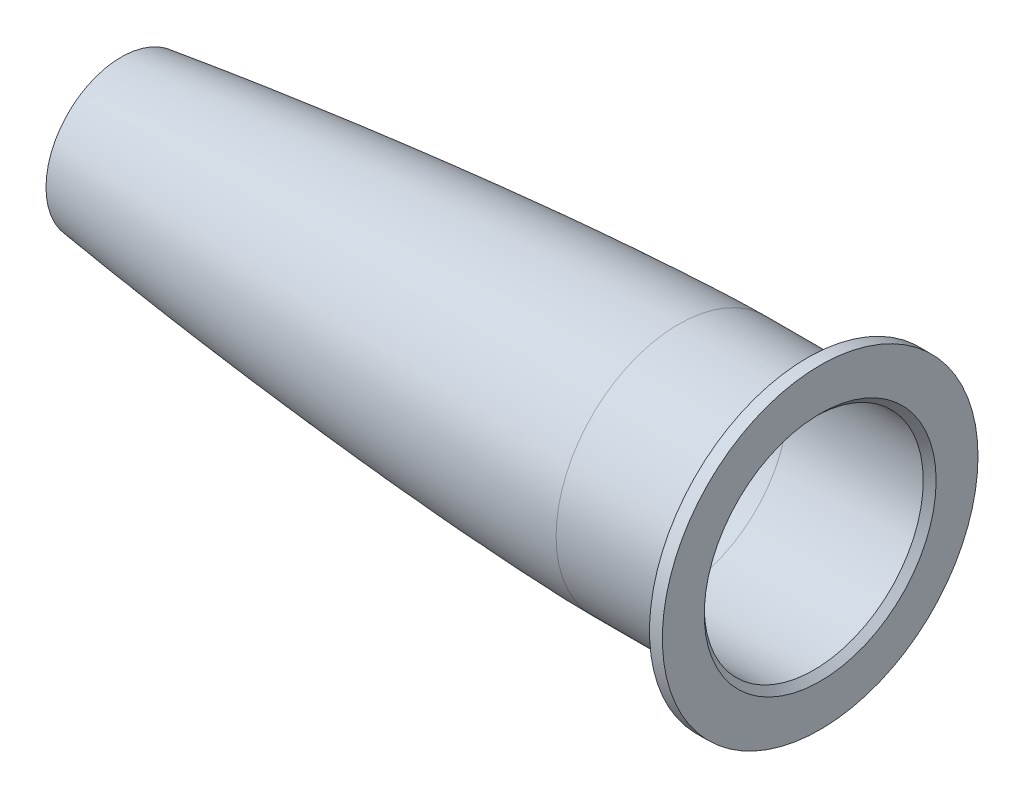
ISO-10303-21;
HEADER;
FILE_DESCRIPTION(('STEP AP214'),'2;1');
FILE_NAME('part.step','',(''),(''),'','','');
FILE_SCHEMA(('AUTOMOTIVE_DESIGN { 1 0 10303 214 1 1 1 1 }'));
ENDSEC;
DATA;
#1=APPLICATION_CONTEXT('core data for automotive mechanical design processes');
#2=APPLICATION_PROTOCOL_DEFINITION('international standard','automotive_design',2000,#1);
#3=PRODUCT_CONTEXT('',#1,'mechanical');
#4=PRODUCT('Part','Part','',(#3));
#5=PRODUCT_RELATED_PRODUCT_CATEGORY('part','',(#4));
#6=PRODUCT_DEFINITION_FORMATION('','',#4);
#7=PRODUCT_DEFINITION_CONTEXT('part definition',#1,'design');
#8=PRODUCT_DEFINITION('design','',#6,#7);
#9=PRODUCT_DEFINITION_SHAPE('','',#8);
#10=(LENGTH_UNIT() NAMED_UNIT(*) SI_UNIT(.MILLI.,.METRE.));
#11=(NAMED_UNIT(*) PLANE_ANGLE_UNIT() SI_UNIT($,.RADIAN.));
#12=(NAMED_UNIT(*) SI_UNIT($,.STERADIAN.) SOLID_ANGLE_UNIT());
#13=UNCERTAINTY_MEASURE_WITH_UNIT(LENGTH_MEASURE(1.E-05),#10,'distance_accuracy_value','');
#14=(GEOMETRIC_REPRESENTATION_CONTEXT(3) GLOBAL_UNCERTAINTY_ASSIGNED_CONTEXT((#13)) GLOBAL_UNIT_ASSIGNED_CONTEXT((#10,
#11,#12)) REPRESENTATION_CONTEXT('',''));
#15=CARTESIAN_POINT('',(0.,0.,0.));
#16=DIRECTION('',(0.,0.,1.));
#17=DIRECTION('',(1.,0.,0.));
#18=AXIS2_PLACEMENT_3D('',#15,#16,#17);
#19=CARTESIAN_POINT('',(125.264208200176,23.137719496653,0.));
#20=CARTESIAN_POINT('',(125.698148070877,23.1955515819391,0.));
#21=CARTESIAN_POINT('',(126.421359219837,23.2916745462031,0.));
#22=CARTESIAN_POINT('',(140.922183115305,25.2102916379022,0.));
#23=CARTESIAN_POINT('',(169.534203287424,28.6684115538221,0.));
#24=CARTESIAN_POINT('',(205.200950651116,32.2375037350173,0.));
#25=CARTESIAN_POINT('',(234.354838071152,34.6602193077557,0.));
#26=CARTESIAN_POINT('',(256.239727532149,36.2004604562795,0.));
#27=CARTESIAN_POINT('',(274.483617298194,37.2162146140114,0.));
#28=CARTESIAN_POINT('',(289.091810145958,37.78884544925,0.));
#29=CARTESIAN_POINT('',(296.367863688192,37.9807567908053,0.));
#30=CARTESIAN_POINT('',(300.010580524136,38.0000279870686,0.));
#31=B_SPLINE_CURVE_WITH_KNOTS('',3,(#19,#20,#21,#22,#23,#24,#25,#26,#27,#28,#29,#30),
.UNSPECIFIED.,.F.,.F.,(4,1,1,1,1,1,1,1,1,4),(0.421150248976721,0.425481180540384,
0.428368468249493,0.565862686732591,0.71057512448846,0.782931343366395,0.85528756224433,
0.927643781122265,0.963821890561233,1.0000000000002),.UNSPECIFIED.);
#32=CARTESIAN_POINT('',(0.,0.,0.));
#33=DIRECTION('',(-1.,0.,0.));
#34=AXIS1_PLACEMENT('',#32,#33);
#35=SURFACE_OF_REVOLUTION('',#31,#34);
#36=CARTESIAN_POINT('',(300.010580524136,0.,0.));
#37=DIRECTION('',(-1.,0.,0.));
#38=DIRECTION('',(0.,0.,1.));
#39=AXIS2_PLACEMENT_3D('',#36,#37,#38);
#40=CIRCLE('',#39,38.0000279870686);
#41=CARTESIAN_POINT('',(300.010580524136,0.,38.0000279870686));
#42=VERTEX_POINT('',#41);
#43=EDGE_CURVE('E69',#42,#42,#40,.T.);
#44=ORIENTED_EDGE('',*,*,#43,.T.);
#45=EDGE_LOOP('',(#44));
#46=FACE_BOUND('',#45,.T.);
#47=CARTESIAN_POINT('',(127.000000000001,0.,0.));
#48=DIRECTION('',(-1.,0.,0.));
#49=DIRECTION('',(0.,0.,1.));
#50=AXIS2_PLACEMENT_3D('',#47,#48,#49);
#51=CIRCLE('',#50,23.3682178161955);
#52=CARTESIAN_POINT('',(127.000000000001,0.,23.3682178161955));
#53=VERTEX_POINT('',#52);
#54=EDGE_CURVE('E52',#53,#53,#51,.T.);
#55=ORIENTED_EDGE('',*,*,#54,.F.);
#56=EDGE_LOOP('',(#55));
#57=FACE_BOUND('',#56,.T.);
#58=ADVANCED_FACE('F40',(#46,#57),#35,.F.);
#59=CARTESIAN_POINT('',(127.,-4.9778557492083E-12,0.));
#60=DIRECTION('',(-1.,0.,0.));
#61=DIRECTION('',(0.,0.,1.));
#62=AXIS2_PLACEMENT_3D('',#59,#60,#61);
#63=PLANE('',#62);
#64=CARTESIAN_POINT('',(127.,-15.,0.));
#65=DIRECTION('',(-1.,0.,0.));
#66=DIRECTION('',(0.,0.,1.));
#67=AXIS2_PLACEMENT_3D('',#64,#65,#66);
#68=CIRCLE('',#67,1.5);
#69=CARTESIAN_POINT('',(127.,-15.,1.5));
#70=VERTEX_POINT('',#69);
#71=EDGE_CURVE('E159',#70,#70,#68,.T.);
#72=ORIENTED_EDGE('',*,*,#71,.F.);
#73=EDGE_LOOP('',(#72));
#74=FACE_BOUND('',#73,.T.);
#75=CARTESIAN_POINT('',(127.,0.,-15.));
#76=DIRECTION('',(-1.,0.,0.));
#77=DIRECTION('',(0.,0.,1.));
#78=AXIS2_PLACEMENT_3D('',#75,#76,#77);
#79=CIRCLE('',#78,1.5);
#80=CARTESIAN_POINT('',(127.,0.,-13.5));
#81=VERTEX_POINT('',#80);
#82=EDGE_CURVE('E163',#81,#81,#79,.T.);
#83=ORIENTED_EDGE('',*,*,#82,.F.);
#84=EDGE_LOOP('',(#83));
#85=FACE_BOUND('',#84,.T.);
#86=CARTESIAN_POINT('',(127.,0.,15.));
#87=DIRECTION('',(-1.,0.,0.));
#88=DIRECTION('',(0.,0.,1.));
#89=AXIS2_PLACEMENT_3D('',#86,#87,#88);
#90=CIRCLE('',#89,1.5);
#91=CARTESIAN_POINT('',(127.,0.,16.5));
#92=VERTEX_POINT('',#91);
#93=EDGE_CURVE('E170',#92,#92,#90,.T.);
#94=ORIENTED_EDGE('',*,*,#93,.F.);
#95=EDGE_LOOP('',(#94));
#96=FACE_BOUND('',#95,.T.);
#97=CARTESIAN_POINT('',(127.,15.,0.));
#98=DIRECTION('',(-1.,0.,0.));
#99=DIRECTION('',(0.,0.,1.));
#100=AXIS2_PLACEMENT_3D('',#97,#98,#99);
#101=CIRCLE('',#100,1.5);
#102=CARTESIAN_POINT('',(127.,15.,1.5));
#103=VERTEX_POINT('',#102);
#104=EDGE_CURVE('E173',#103,#103,#101,.T.);
#105=ORIENTED_EDGE('',*,*,#104,.F.);
#106=EDGE_LOOP('',(#105));
#107=FACE_BOUND('',#106,.T.);
#108=CARTESIAN_POINT('',(127.,0.,0.));
#109=DIRECTION('',(-1.,0.,0.));
#110=DIRECTION('',(0.,0.,1.));
#111=AXIS2_PLACEMENT_3D('',#108,#109,#110);
#112=CIRCLE('',#111,3.1);
#113=CARTESIAN_POINT('',(127.,0.,3.1));
#114=VERTEX_POINT('',#113);
#115=EDGE_CURVE('E61',#114,#114,#112,.T.);
#116=ORIENTED_EDGE('',*,*,#115,.F.);
#117=EDGE_LOOP('',(#116));
#118=FACE_BOUND('',#117,.T.);
#119=ORIENTED_EDGE('',*,*,#54,.T.);
#120=EDGE_LOOP('',(#119));
#121=FACE_BOUND('',#120,.T.);
#122=ADVANCED_FACE('F85',(#74,#85,#96,#107,#118,#121),#63,.T.);
#123=CARTESIAN_POINT('',(131.,0.,0.));
#124=DIRECTION('',(-1.,0.,0.));
#125=DIRECTION('',(0.,0.,1.));
#126=AXIS2_PLACEMENT_3D('',#123,#124,#125);
#127=PLANE('',#126);
#128=CARTESIAN_POINT('',(131.,0.,0.));
#129=DIRECTION('',(-1.,0.,0.));
#130=DIRECTION('',(0.,0.,1.));
#131=AXIS2_PLACEMENT_3D('',#128,#129,#130);
#132=CIRCLE('',#131,3.1);
#133=CARTESIAN_POINT('',(131.,0.,3.1));
#134=VERTEX_POINT('',#133);
#135=EDGE_CURVE('E59',#134,#134,#132,.T.);
#136=ORIENTED_EDGE('',*,*,#135,.T.);
#137=EDGE_LOOP('',(#136));
#138=FACE_BOUND('',#137,.T.);
#139=CARTESIAN_POINT('',(131.,0.,0.));
#140=DIRECTION('',(-1.,0.,0.));
#141=DIRECTION('',(0.,0.,1.));
#142=AXIS2_PLACEMENT_3D('',#139,#140,#141);
#143=CIRCLE('',#142,20.);
#144=CARTESIAN_POINT('',(131.,0.,20.));
#145=VERTEX_POINT('',#144);
#146=EDGE_CURVE('E56',#145,#145,#143,.T.);
#147=ORIENTED_EDGE('',*,*,#146,.F.);
#148=EDGE_LOOP('',(#147));
#149=FACE_BOUND('',#148,.T.);
#150=ADVANCED_FACE('F89',(#138,#149),#127,.F.);
#151=CARTESIAN_POINT('',(348.202358755479,0.,0.));
#152=DIRECTION('',(-1.,0.,0.));
#153=DIRECTION('',(0.,0.,1.));
#154=AXIS2_PLACEMENT_3D('',#151,#152,#153);
#155=DEGENERATE_TOROIDAL_SURFACE('',#154,1574.94025359985,1609.66185181922,.F.);
#156=ORIENTED_EDGE('',*,*,#146,.T.);
#157=EDGE_LOOP('',(#156));
#158=FACE_BOUND('',#157,.T.);
#159=CARTESIAN_POINT('',(300.010580524075,0.,0.));
#160=DIRECTION('',(-1.,0.,0.));
#161=DIRECTION('',(0.,0.,1.));
#162=AXIS2_PLACEMENT_3D('',#159,#160,#161);
#163=CIRCLE('',#162,34.0000279870682);
#164=CARTESIAN_POINT('',(300.010580524075,0.,34.0000279870682));
#165=VERTEX_POINT('',#164);
#166=EDGE_CURVE('E66',#165,#165,#163,.T.);
#167=ORIENTED_EDGE('',*,*,#166,.F.);
#168=EDGE_LOOP('',(#167));
#169=FACE_BOUND('',#168,.T.);
#170=ADVANCED_FACE('F93',(#158,#169),#155,.T.);
#171=CARTESIAN_POINT('',(0.,0.,0.));
#172=DIRECTION('',(-1.,0.,0.));
#173=DIRECTION('',(0.,0.,1.));
#174=AXIS2_PLACEMENT_3D('',#171,#172,#173);
#175=CYLINDRICAL_SURFACE('',#174,34.0000279870683);
#176=CARTESIAN_POINT('',(342.,0.,0.));
#177=DIRECTION('',(1.,0.,0.));
#178=DIRECTION('',(0.,0.,-1.));
#179=AXIS2_PLACEMENT_3D('',#176,#177,#178);
#180=CIRCLE('',#179,34.0000279870683);
#181=CARTESIAN_POINT('',(342.,0.,-34.0000279870683));
#182=VERTEX_POINT('',#181);
#183=EDGE_CURVE('E48',#182,#182,#180,.T.);
#184=ORIENTED_EDGE('',*,*,#183,.T.);
#185=EDGE_LOOP('',(#184));
#186=FACE_BOUND('',#185,.T.);
#187=ORIENTED_EDGE('',*,*,#166,.T.);
#188=EDGE_LOOP('',(#187));
#189=FACE_BOUND('',#188,.T.);
#190=ADVANCED_FACE('F97',(#186,#189),#175,.F.);
#191=CARTESIAN_POINT('',(0.,0.,0.));
#192=DIRECTION('',(-1.,0.,0.));
#193=DIRECTION('',(0.,0.,1.));
#194=AXIS2_PLACEMENT_3D('',#191,#192,#193);
#195=CYLINDRICAL_SURFACE('',#194,38.0000279870684);
#196=ORIENTED_EDGE('',*,*,#43,.F.);
#197=EDGE_LOOP('',(#196));
#198=FACE_BOUND('',#197,.T.);
#199=CARTESIAN_POINT('',(340.,0.,0.));
#200=DIRECTION('',(-1.,0.,0.));
#201=DIRECTION('',(0.,0.,1.));
#202=AXIS2_PLACEMENT_3D('',#199,#200,#201);
#203=CIRCLE('',#202,38.0000279870683);
#204=CARTESIAN_POINT('',(340.,0.,38.0000279870683));
#205=VERTEX_POINT('',#204);
#206=EDGE_CURVE('E62',#205,#205,#203,.T.);
#207=ORIENTED_EDGE('',*,*,#206,.T.);
#208=EDGE_LOOP('',(#207));
#209=FACE_BOUND('',#208,.T.);
#210=ADVANCED_FACE('F101',(#198,#209),#195,.T.);
#211=CARTESIAN_POINT('',(340.,0.,0.));
#212=DIRECTION('',(-1.,0.,0.));
#213=DIRECTION('',(0.,0.,1.));
#214=AXIS2_PLACEMENT_3D('',#211,#212,#213);
#215=CYLINDRICAL_SURFACE('',#214,3.1);
#216=ORIENTED_EDGE('',*,*,#115,.T.);
#217=EDGE_LOOP('',(#216));
#218=FACE_BOUND('',#217,.T.);
#219=ORIENTED_EDGE('',*,*,#135,.F.);
#220=EDGE_LOOP('',(#219));
#221=FACE_BOUND('',#220,.T.);
#222=ADVANCED_FACE('F104',(#218,#221),#215,.F.);
#223=CARTESIAN_POINT('',(344.,0.,0.));
#224=DIRECTION('',(1.,0.,0.));
#225=DIRECTION('',(0.,0.,-1.));
#226=AXIS2_PLACEMENT_3D('',#223,#224,#225);
#227=PLANE('',#226);
#228=CARTESIAN_POINT('',(344.,0.,0.));
#229=DIRECTION('',(1.,0.,0.));
#230=DIRECTION('',(0.,0.,-1.));
#231=AXIS2_PLACEMENT_3D('',#228,#229,#230);
#232=CIRCLE('',#231,36.0000279870683);
#233=CARTESIAN_POINT('',(344.,0.,-36.0000279870683));
#234=VERTEX_POINT('',#233);
#235=EDGE_CURVE('E10',#234,#234,#232,.F.);
#236=ORIENTED_EDGE('',*,*,#235,.T.);
#237=EDGE_LOOP('',(#236));
#238=FACE_BOUND('',#237,.T.);
#239=CARTESIAN_POINT('',(344.,0.,0.));
#240=DIRECTION('',(1.,0.,0.));
#241=DIRECTION('',(0.,0.,-1.));
#242=AXIS2_PLACEMENT_3D('',#239,#240,#241);
#243=CIRCLE('',#242,49.0000279870683);
#244=CARTESIAN_POINT('',(344.,0.,-49.0000279870683));
#245=VERTEX_POINT('',#244);
#246=EDGE_CURVE('E72',#245,#245,#243,.T.);
#247=ORIENTED_EDGE('',*,*,#246,.T.);
#248=EDGE_LOOP('',(#247));
#249=FACE_BOUND('',#248,.T.);
#250=ADVANCED_FACE('F108',(#238,#249),#227,.T.);
#251=CARTESIAN_POINT('',(340.,0.,0.));
#252=DIRECTION('',(1.,0.,0.));
#253=DIRECTION('',(0.,0.,-1.));
#254=AXIS2_PLACEMENT_3D('',#251,#252,#253);
#255=PLANE('',#254);
#256=ORIENTED_EDGE('',*,*,#206,.F.);
#257=EDGE_LOOP('',(#256));
#258=FACE_BOUND('',#257,.T.);
#259=CARTESIAN_POINT('',(340.,0.,0.));
#260=DIRECTION('',(1.,0.,0.));
#261=DIRECTION('',(0.,0.,-1.));
#262=AXIS2_PLACEMENT_3D('',#259,#260,#261);
#263=CIRCLE('',#262,49.0000279870683);
#264=CARTESIAN_POINT('',(340.,0.,-49.0000279870683));
#265=VERTEX_POINT('',#264);
#266=EDGE_CURVE('E179',#265,#265,#263,.T.);
#267=ORIENTED_EDGE('',*,*,#266,.F.);
#268=EDGE_LOOP('',(#267));
#269=FACE_BOUND('',#268,.T.);
#270=ADVANCED_FACE('F113',(#258,#269),#255,.F.);
#271=CARTESIAN_POINT('',(344.,0.,0.));
#272=DIRECTION('',(-1.,0.,0.));
#273=DIRECTION('',(0.,0.,1.));
#274=AXIS2_PLACEMENT_3D('',#271,#272,#273);
#275=CYLINDRICAL_SURFACE('',#274,49.0000279870683);
#276=ORIENTED_EDGE('',*,*,#246,.F.);
#277=EDGE_LOOP('',(#276));
#278=FACE_BOUND('',#277,.T.);
#279=ORIENTED_EDGE('',*,*,#266,.T.);
#280=EDGE_LOOP('',(#279));
#281=FACE_BOUND('',#280,.T.);
#282=ADVANCED_FACE('F110',(#278,#281),#275,.T.);
#283=CARTESIAN_POINT('',(342.,0.,0.));
#284=DIRECTION('',(1.,0.,0.));
#285=DIRECTION('',(0.,0.,-1.));
#286=AXIS2_PLACEMENT_3D('',#283,#284,#285);
#287=CONICAL_SURFACE('',#286,34.0000279870683,0.785398163397441);
#288=ORIENTED_EDGE('',*,*,#235,.F.);
#289=EDGE_LOOP('',(#288));
#290=FACE_BOUND('',#289,.T.);
#291=ORIENTED_EDGE('',*,*,#183,.F.);
#292=EDGE_LOOP('',(#291));
#293=FACE_BOUND('',#292,.T.);
#294=ADVANCED_FACE('F43',(#290,#293),#287,.F.);
#295=CARTESIAN_POINT('',(125.,15.,0.));
#296=DIRECTION('',(1.,0.,0.));
#297=DIRECTION('',(0.,0.,-1.));
#298=AXIS2_PLACEMENT_3D('',#295,#296,#297);
#299=CYLINDRICAL_SURFACE('',#298,1.5);
#300=CARTESIAN_POINT('',(125.,15.,0.));
#301=DIRECTION('',(-1.,0.,0.));
#302=DIRECTION('',(0.,0.,1.));
#303=AXIS2_PLACEMENT_3D('',#300,#301,#302);
#304=CIRCLE('',#303,1.5);
#305=CARTESIAN_POINT('',(125.,15.,1.5));
#306=VERTEX_POINT('',#305);
#307=EDGE_CURVE('E176',#306,#306,#304,.T.);
#308=ORIENTED_EDGE('',*,*,#307,.F.);
#309=EDGE_LOOP('',(#308));
#310=FACE_BOUND('',#309,.T.);
#311=ORIENTED_EDGE('',*,*,#104,.T.);
#312=EDGE_LOOP('',(#311));
#313=FACE_BOUND('',#312,.T.);
#314=ADVANCED_FACE('F120',(#310,#313),#299,.T.);
#315=CARTESIAN_POINT('',(125.,15.,0.));
#316=DIRECTION('',(-1.,0.,0.));
#317=DIRECTION('',(0.,0.,1.));
#318=AXIS2_PLACEMENT_3D('',#315,#316,#317);
#319=PLANE('',#318);
#320=ORIENTED_EDGE('',*,*,#307,.T.);
#321=EDGE_LOOP('',(#320));
#322=FACE_BOUND('',#321,.T.);
#323=ADVANCED_FACE('F123',(#322),#319,.T.);
#324=CARTESIAN_POINT('',(125.,0.,15.));
#325=DIRECTION('',(1.,0.,0.));
#326=DIRECTION('',(0.,0.,-1.));
#327=AXIS2_PLACEMENT_3D('',#324,#325,#326);
#328=CYLINDRICAL_SURFACE('',#327,1.5);
#329=CARTESIAN_POINT('',(125.,0.,15.));
#330=DIRECTION('',(-1.,0.,0.));
#331=DIRECTION('',(0.,0.,1.));
#332=AXIS2_PLACEMENT_3D('',#329,#330,#331);
#333=CIRCLE('',#332,1.5);
#334=CARTESIAN_POINT('',(125.,0.,16.5));
#335=VERTEX_POINT('',#334);
#336=EDGE_CURVE('E168',#335,#335,#333,.T.);
#337=ORIENTED_EDGE('',*,*,#336,.F.);
#338=EDGE_LOOP('',(#337));
#339=FACE_BOUND('',#338,.T.);
#340=ORIENTED_EDGE('',*,*,#93,.T.);
#341=EDGE_LOOP('',(#340));
#342=FACE_BOUND('',#341,.T.);
#343=ADVANCED_FACE('F127',(#339,#342),#328,.T.);
#344=CARTESIAN_POINT('',(125.,0.,15.));
#345=DIRECTION('',(-1.,0.,0.));
#346=DIRECTION('',(0.,0.,1.));
#347=AXIS2_PLACEMENT_3D('',#344,#345,#346);
#348=PLANE('',#347);
#349=ORIENTED_EDGE('',*,*,#336,.T.);
#350=EDGE_LOOP('',(#349));
#351=FACE_BOUND('',#350,.T.);
#352=ADVANCED_FACE('F129',(#351),#348,.T.);
#353=CARTESIAN_POINT('',(125.,0.,-15.));
#354=DIRECTION('',(1.,0.,0.));
#355=DIRECTION('',(0.,0.,-1.));
#356=AXIS2_PLACEMENT_3D('',#353,#354,#355);
#357=CYLINDRICAL_SURFACE('',#356,1.5);
#358=CARTESIAN_POINT('',(125.,0.,-15.));
#359=DIRECTION('',(-1.,0.,0.));
#360=DIRECTION('',(0.,0.,1.));
#361=AXIS2_PLACEMENT_3D('',#358,#359,#360);
#362=CIRCLE('',#361,1.5);
#363=CARTESIAN_POINT('',(125.,0.,-13.5));
#364=VERTEX_POINT('',#363);
#365=EDGE_CURVE('E160',#364,#364,#362,.T.);
#366=ORIENTED_EDGE('',*,*,#365,.F.);
#367=EDGE_LOOP('',(#366));
#368=FACE_BOUND('',#367,.T.);
#369=ORIENTED_EDGE('',*,*,#82,.T.);
#370=EDGE_LOOP('',(#369));
#371=FACE_BOUND('',#370,.T.);
#372=ADVANCED_FACE('F132',(#368,#371),#357,.T.);
#373=CARTESIAN_POINT('',(125.,0.,-15.));
#374=DIRECTION('',(-1.,0.,0.));
#375=DIRECTION('',(0.,0.,1.));
#376=AXIS2_PLACEMENT_3D('',#373,#374,#375);
#377=PLANE('',#376);
#378=ORIENTED_EDGE('',*,*,#365,.T.);
#379=EDGE_LOOP('',(#378));
#380=FACE_BOUND('',#379,.T.);
#381=ADVANCED_FACE('F137',(#380),#377,.T.);
#382=CARTESIAN_POINT('',(125.,-15.,0.));
#383=DIRECTION('',(1.,0.,0.));
#384=DIRECTION('',(0.,0.,-1.));
#385=AXIS2_PLACEMENT_3D('',#382,#383,#384);
#386=CYLINDRICAL_SURFACE('',#385,1.5);
#387=CARTESIAN_POINT('',(125.,-15.,0.));
#388=DIRECTION('',(-1.,0.,0.));
#389=DIRECTION('',(0.,0.,1.));
#390=AXIS2_PLACEMENT_3D('',#387,#388,#389);
#391=CIRCLE('',#390,1.5);
#392=CARTESIAN_POINT('',(125.,-15.,1.5));
#393=VERTEX_POINT('',#392);
#394=EDGE_CURVE('E156',#393,#393,#391,.T.);
#395=ORIENTED_EDGE('',*,*,#394,.F.);
#396=EDGE_LOOP('',(#395));
#397=FACE_BOUND('',#396,.T.);
#398=ORIENTED_EDGE('',*,*,#71,.T.);
#399=EDGE_LOOP('',(#398));
#400=FACE_BOUND('',#399,.T.);
#401=ADVANCED_FACE('F140',(#397,#400),#386,.T.);
#402=CARTESIAN_POINT('',(125.,-15.,0.));
#403=DIRECTION('',(-1.,0.,0.));
#404=DIRECTION('',(0.,0.,1.));
#405=AXIS2_PLACEMENT_3D('',#402,#403,#404);
#406=PLANE('',#405);
#407=ORIENTED_EDGE('',*,*,#394,.T.);
#408=EDGE_LOOP('',(#407));
#409=FACE_BOUND('',#408,.T.);
#410=ADVANCED_FACE('F145',(#409),#406,.T.);
#411=CLOSED_SHELL('',(#58,#122,#150,#170,#190,#210,#222,#250,#270,#282,#294,#314,#323,#343,#352,
#372,#381,#401,#410));
#412=MANIFOLD_SOLID_BREP('B2',#411);
#413=ADVANCED_BREP_SHAPE_REPRESENTATION('',(#18,#412),#14);
#414=SHAPE_DEFINITION_REPRESENTATION(#9,#413);
ENDSEC;
END-ISO-10303-21;
